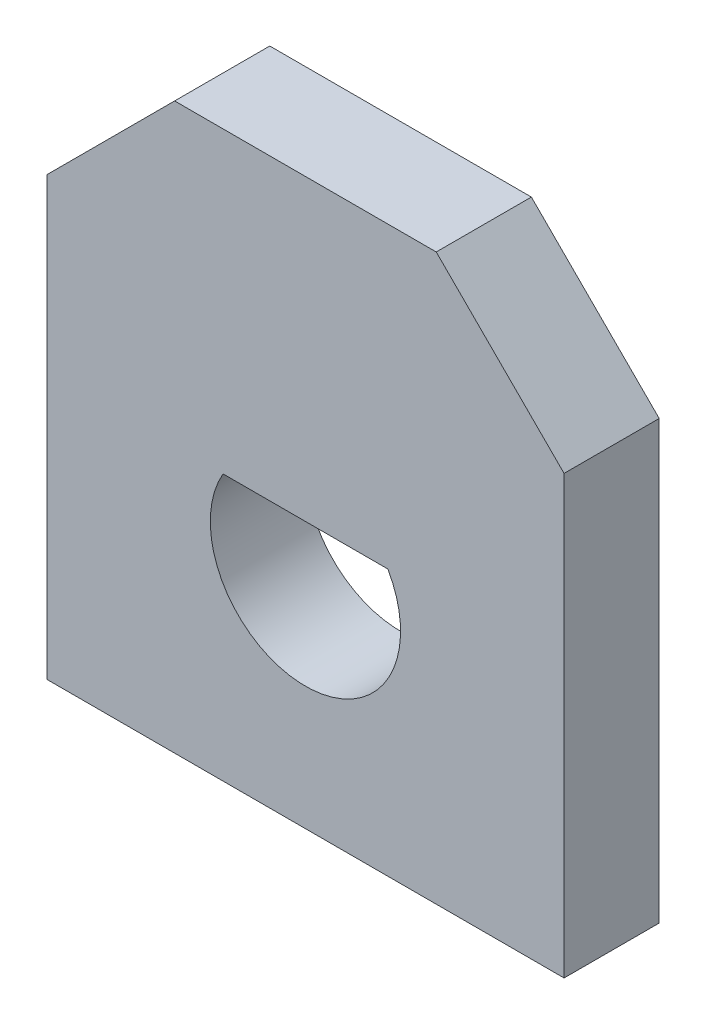
ISO-10303-21;
HEADER;
FILE_DESCRIPTION(('STEP AP214'),'2;1');
FILE_NAME('part.step','',(''),(''),'','','');
FILE_SCHEMA(('AUTOMOTIVE_DESIGN { 1 0 10303 214 1 1 1 1 }'));
ENDSEC;
DATA;
#1=APPLICATION_CONTEXT('core data for automotive mechanical design processes');
#2=APPLICATION_PROTOCOL_DEFINITION('international standard','automotive_design',2000,#1);
#3=PRODUCT_CONTEXT('',#1,'mechanical');
#4=PRODUCT('Part','Part','',(#3));
#5=PRODUCT_RELATED_PRODUCT_CATEGORY('part','',(#4));
#6=PRODUCT_DEFINITION_FORMATION('','',#4);
#7=PRODUCT_DEFINITION_CONTEXT('part definition',#1,'design');
#8=PRODUCT_DEFINITION('design','',#6,#7);
#9=PRODUCT_DEFINITION_SHAPE('','',#8);
#10=(LENGTH_UNIT() NAMED_UNIT(*) SI_UNIT(.MILLI.,.METRE.));
#11=(NAMED_UNIT(*) PLANE_ANGLE_UNIT() SI_UNIT($,.RADIAN.));
#12=(NAMED_UNIT(*) SI_UNIT($,.STERADIAN.) SOLID_ANGLE_UNIT());
#13=UNCERTAINTY_MEASURE_WITH_UNIT(LENGTH_MEASURE(1.E-05),#10,'distance_accuracy_value','');
#14=(GEOMETRIC_REPRESENTATION_CONTEXT(3) GLOBAL_UNCERTAINTY_ASSIGNED_CONTEXT((#13)) GLOBAL_UNIT_ASSIGNED_CONTEXT((#10,
#11,#12)) REPRESENTATION_CONTEXT('',''));
#15=CARTESIAN_POINT('',(0.,0.,0.));
#16=DIRECTION('',(0.,0.,1.));
#17=DIRECTION('',(1.,0.,0.));
#18=AXIS2_PLACEMENT_3D('',#15,#16,#17);
#19=CARTESIAN_POINT('',(5.5245,-11.501146748355,2.032));
#20=DIRECTION('',(1.,0.,0.));
#21=DIRECTION('',(0.,1.,0.));
#22=AXIS2_PLACEMENT_3D('',#19,#20,#21);
#23=PLANE('',#22);
#24=DIRECTION('',(0.,-1.,0.));
#25=VECTOR('',#24,1.);
#26=CARTESIAN_POINT('',(5.5245,-11.501146748355,0.));
#27=LINE('',#26,#25);
#28=CARTESIAN_POINT('',(5.5245,4.66725,0.));
#29=VERTEX_POINT('',#28);
#30=CARTESIAN_POINT('',(5.5245,-4.66724999999999,0.));
#31=VERTEX_POINT('',#30);
#32=EDGE_CURVE('E143',#29,#31,#27,.T.);
#33=ORIENTED_EDGE('',*,*,#32,.F.);
#34=DIRECTION('',(0.,0.,-1.));
#35=VECTOR('',#34,1.);
#36=CARTESIAN_POINT('',(5.5245,4.66725,2.032));
#37=LINE('',#36,#35);
#38=CARTESIAN_POINT('',(5.5245,4.66725,2.032));
#39=VERTEX_POINT('',#38);
#40=EDGE_CURVE('E11',#39,#29,#37,.T.);
#41=ORIENTED_EDGE('',*,*,#40,.F.);
#42=DIRECTION('',(0.,-1.,0.));
#43=VECTOR('',#42,1.);
#44=CARTESIAN_POINT('',(5.5245,-11.501146748355,2.032));
#45=LINE('',#44,#43);
#46=CARTESIAN_POINT('',(5.5245,-4.66724999999999,2.032));
#47=VERTEX_POINT('',#46);
#48=EDGE_CURVE('E199',#39,#47,#45,.T.);
#49=ORIENTED_EDGE('',*,*,#48,.T.);
#50=DIRECTION('',(0.,0.,-1.));
#51=VECTOR('',#50,1.);
#52=CARTESIAN_POINT('',(5.5245,-4.66724999999999,2.032));
#53=LINE('',#52,#51);
#54=EDGE_CURVE('E86',#47,#31,#53,.T.);
#55=ORIENTED_EDGE('',*,*,#54,.T.);
#56=EDGE_LOOP('',(#33,#41,#49,#55));
#57=FACE_BOUND('',#56,.T.);
#58=ADVANCED_FACE('F32',(#57),#23,.T.);
#59=CARTESIAN_POINT('',(10.8464483741775,-0.654698374177521,2.032));
#60=DIRECTION('',(0.707106781186549,0.707106781186546,0.));
#61=DIRECTION('',(-0.707106781186546,0.707106781186549,0.));
#62=AXIS2_PLACEMENT_3D('',#59,#60,#61);
#63=PLANE('',#62);
#64=DIRECTION('',(0.707106781186546,-0.707106781186549,0.));
#65=VECTOR('',#64,1.);
#66=CARTESIAN_POINT('',(10.8464483741775,-0.654698374177521,0.));
#67=LINE('',#66,#65);
#68=CARTESIAN_POINT('',(2.794,7.39775000000001,0.));
#69=VERTEX_POINT('',#68);
#70=EDGE_CURVE('E145',#69,#29,#67,.T.);
#71=ORIENTED_EDGE('',*,*,#70,.F.);
#72=DIRECTION('',(0.,0.,-1.));
#73=VECTOR('',#72,1.);
#74=CARTESIAN_POINT('',(2.794,7.39775000000001,2.032));
#75=LINE('',#74,#73);
#76=CARTESIAN_POINT('',(2.794,7.39775000000001,2.032));
#77=VERTEX_POINT('',#76);
#78=EDGE_CURVE('E42',#77,#69,#75,.T.);
#79=ORIENTED_EDGE('',*,*,#78,.F.);
#80=DIRECTION('',(0.707106781186546,-0.707106781186549,0.));
#81=VECTOR('',#80,1.);
#82=CARTESIAN_POINT('',(10.8464483741775,-0.654698374177521,2.032));
#83=LINE('',#82,#81);
#84=EDGE_CURVE('E131',#77,#39,#83,.T.);
#85=ORIENTED_EDGE('',*,*,#84,.T.);
#86=ORIENTED_EDGE('',*,*,#40,.T.);
#87=EDGE_LOOP('',(#71,#79,#85,#86));
#88=FACE_BOUND('',#87,.T.);
#89=ADVANCED_FACE('F175',(#88),#63,.T.);
#90=CARTESIAN_POINT('',(0.,7.39775000000001,2.032));
#91=DIRECTION('',(0.,1.,0.));
#92=DIRECTION('',(0.,0.,1.));
#93=AXIS2_PLACEMENT_3D('',#90,#91,#92);
#94=PLANE('',#93);
#95=DIRECTION('',(1.,0.,0.));
#96=VECTOR('',#95,1.);
#97=CARTESIAN_POINT('',(0.,7.39775000000001,0.));
#98=LINE('',#97,#96);
#99=CARTESIAN_POINT('',(-2.794,7.39775000000001,0.));
#100=VERTEX_POINT('',#99);
#101=EDGE_CURVE('E148',#100,#69,#98,.T.);
#102=ORIENTED_EDGE('',*,*,#101,.F.);
#103=DIRECTION('',(0.,0.,-1.));
#104=VECTOR('',#103,1.);
#105=CARTESIAN_POINT('',(-2.794,7.39775000000001,2.032));
#106=LINE('',#105,#104);
#107=CARTESIAN_POINT('',(-2.794,7.39775000000001,2.032));
#108=VERTEX_POINT('',#107);
#109=EDGE_CURVE('E118',#108,#100,#106,.T.);
#110=ORIENTED_EDGE('',*,*,#109,.F.);
#111=DIRECTION('',(1.,0.,0.));
#112=VECTOR('',#111,1.);
#113=CARTESIAN_POINT('',(0.,7.39775000000001,2.032));
#114=LINE('',#113,#112);
#115=EDGE_CURVE('E129',#108,#77,#114,.T.);
#116=ORIENTED_EDGE('',*,*,#115,.T.);
#117=ORIENTED_EDGE('',*,*,#78,.T.);
#118=EDGE_LOOP('',(#102,#110,#116,#117));
#119=FACE_BOUND('',#118,.T.);
#120=ADVANCED_FACE('F180',(#119),#94,.T.);
#121=CARTESIAN_POINT('',(-10.8464483741775,-0.654698374177511,2.032));
#122=DIRECTION('',(-0.707106781186549,0.707106781186546,0.));
#123=DIRECTION('',(-0.707106781186546,-0.707106781186549,0.));
#124=AXIS2_PLACEMENT_3D('',#121,#122,#123);
#125=PLANE('',#124);
#126=DIRECTION('',(0.707106781186546,0.707106781186549,0.));
#127=VECTOR('',#126,1.);
#128=CARTESIAN_POINT('',(-10.8464483741775,-0.654698374177511,0.));
#129=LINE('',#128,#127);
#130=CARTESIAN_POINT('',(-5.5245,4.66725,0.));
#131=VERTEX_POINT('',#130);
#132=EDGE_CURVE('E115',#131,#100,#129,.T.);
#133=ORIENTED_EDGE('',*,*,#132,.F.);
#134=DIRECTION('',(0.,0.,-1.));
#135=VECTOR('',#134,1.);
#136=CARTESIAN_POINT('',(-5.5245,4.66725,2.032));
#137=LINE('',#136,#135);
#138=CARTESIAN_POINT('',(-5.5245,4.66725,2.032));
#139=VERTEX_POINT('',#138);
#140=EDGE_CURVE('E109',#139,#131,#137,.T.);
#141=ORIENTED_EDGE('',*,*,#140,.F.);
#142=DIRECTION('',(0.707106781186546,0.707106781186549,0.));
#143=VECTOR('',#142,1.);
#144=CARTESIAN_POINT('',(-10.8464483741775,-0.654698374177511,2.032));
#145=LINE('',#144,#143);
#146=EDGE_CURVE('E113',#139,#108,#145,.T.);
#147=ORIENTED_EDGE('',*,*,#146,.T.);
#148=ORIENTED_EDGE('',*,*,#109,.T.);
#149=EDGE_LOOP('',(#133,#141,#147,#148));
#150=FACE_BOUND('',#149,.T.);
#151=ADVANCED_FACE('F111',(#150),#125,.T.);
#152=CARTESIAN_POINT('',(-5.5245,-11.501146748355,2.032));
#153=DIRECTION('',(1.,0.,0.));
#154=DIRECTION('',(0.,0.,-1.));
#155=AXIS2_PLACEMENT_3D('',#152,#153,#154);
#156=PLANE('',#155);
#157=DIRECTION('',(0.,-1.,0.));
#158=VECTOR('',#157,1.);
#159=CARTESIAN_POINT('',(-5.5245,-11.501146748355,0.));
#160=LINE('',#159,#158);
#161=CARTESIAN_POINT('',(-5.5245,-4.66724999999999,0.));
#162=VERTEX_POINT('',#161);
#163=EDGE_CURVE('E152',#131,#162,#160,.T.);
#164=ORIENTED_EDGE('',*,*,#163,.T.);
#165=DIRECTION('',(0.,0.,-1.));
#166=VECTOR('',#165,1.);
#167=CARTESIAN_POINT('',(-5.5245,-4.66724999999999,2.032));
#168=LINE('',#167,#166);
#169=CARTESIAN_POINT('',(-5.5245,-4.66724999999999,2.032));
#170=VERTEX_POINT('',#169);
#171=EDGE_CURVE('E119',#170,#162,#168,.T.);
#172=ORIENTED_EDGE('',*,*,#171,.F.);
#173=DIRECTION('',(0.,-1.,0.));
#174=VECTOR('',#173,1.);
#175=CARTESIAN_POINT('',(-5.5245,-11.501146748355,2.032));
#176=LINE('',#175,#174);
#177=EDGE_CURVE('E122',#139,#170,#176,.T.);
#178=ORIENTED_EDGE('',*,*,#177,.F.);
#179=ORIENTED_EDGE('',*,*,#140,.T.);
#180=EDGE_LOOP('',(#164,#172,#178,#179));
#181=FACE_BOUND('',#180,.T.);
#182=ADVANCED_FACE('F123',(#181),#156,.F.);
#183=CARTESIAN_POINT('',(0.,0.,2.032));
#184=DIRECTION('',(0.,0.,-1.));
#185=DIRECTION('',(-1.,0.,0.));
#186=AXIS2_PLACEMENT_3D('',#183,#184,#185);
#187=CYLINDRICAL_SURFACE('',#186,2.032);
#188=CARTESIAN_POINT('',(0.,0.,0.));
#189=DIRECTION('',(0.,0.,1.));
#190=DIRECTION('',(1.,0.,0.));
#191=AXIS2_PLACEMENT_3D('',#188,#189,#190);
#192=CIRCLE('',#191,2.032);
#193=CARTESIAN_POINT('',(-1.75976362048998,1.016,0.));
#194=VERTEX_POINT('',#193);
#195=CARTESIAN_POINT('',(1.75976362048998,1.016,0.));
#196=VERTEX_POINT('',#195);
#197=EDGE_CURVE('E137',#194,#196,#192,.T.);
#198=ORIENTED_EDGE('',*,*,#197,.F.);
#199=DIRECTION('',(0.,0.,-1.));
#200=VECTOR('',#199,1.);
#201=CARTESIAN_POINT('',(-1.75976362048998,1.016,2.032));
#202=LINE('',#201,#200);
#203=CARTESIAN_POINT('',(-1.75976362048998,1.016,2.032));
#204=VERTEX_POINT('',#203);
#205=EDGE_CURVE('E36',#204,#194,#202,.T.);
#206=ORIENTED_EDGE('',*,*,#205,.F.);
#207=CARTESIAN_POINT('',(0.,0.,2.032));
#208=DIRECTION('',(0.,0.,1.));
#209=DIRECTION('',(1.,0.,0.));
#210=AXIS2_PLACEMENT_3D('',#207,#208,#209);
#211=CIRCLE('',#210,2.032);
#212=CARTESIAN_POINT('',(1.75976362048998,1.016,2.032));
#213=VERTEX_POINT('',#212);
#214=EDGE_CURVE('E155',#204,#213,#211,.T.);
#215=ORIENTED_EDGE('',*,*,#214,.T.);
#216=DIRECTION('',(0.,0.,-1.));
#217=VECTOR('',#216,1.);
#218=CARTESIAN_POINT('',(1.75976362048998,1.016,2.032));
#219=LINE('',#218,#217);
#220=EDGE_CURVE('E136',#213,#196,#219,.T.);
#221=ORIENTED_EDGE('',*,*,#220,.T.);
#222=EDGE_LOOP('',(#198,#206,#215,#221));
#223=FACE_BOUND('',#222,.T.);
#224=ADVANCED_FACE('F34',(#223),#187,.F.);
#225=CARTESIAN_POINT('',(0.,1.016,2.032));
#226=DIRECTION('',(0.,1.,0.));
#227=DIRECTION('',(0.,0.,1.));
#228=AXIS2_PLACEMENT_3D('',#225,#226,#227);
#229=PLANE('',#228);
#230=DIRECTION('',(1.,0.,0.));
#231=VECTOR('',#230,1.);
#232=CARTESIAN_POINT('',(0.,1.016,0.));
#233=LINE('',#232,#231);
#234=EDGE_CURVE('E140',#194,#196,#233,.T.);
#235=ORIENTED_EDGE('',*,*,#234,.T.);
#236=ORIENTED_EDGE('',*,*,#220,.F.);
#237=DIRECTION('',(1.,0.,0.));
#238=VECTOR('',#237,1.);
#239=CARTESIAN_POINT('',(0.,1.016,2.032));
#240=LINE('',#239,#238);
#241=EDGE_CURVE('E163',#204,#213,#240,.T.);
#242=ORIENTED_EDGE('',*,*,#241,.F.);
#243=ORIENTED_EDGE('',*,*,#205,.T.);
#244=EDGE_LOOP('',(#235,#236,#242,#243));
#245=FACE_BOUND('',#244,.T.);
#246=ADVANCED_FACE('F162',(#245),#229,.F.);
#247=CARTESIAN_POINT('',(0.,-4.66724999999999,2.032));
#248=DIRECTION('',(0.,1.,0.));
#249=DIRECTION('',(0.,0.,1.));
#250=AXIS2_PLACEMENT_3D('',#247,#248,#249);
#251=PLANE('',#250);
#252=DIRECTION('',(1.,0.,0.));
#253=VECTOR('',#252,1.);
#254=CARTESIAN_POINT('',(0.,-4.66724999999999,0.));
#255=LINE('',#254,#253);
#256=EDGE_CURVE('E79',#162,#31,#255,.T.);
#257=ORIENTED_EDGE('',*,*,#256,.T.);
#258=ORIENTED_EDGE('',*,*,#54,.F.);
#259=DIRECTION('',(1.,0.,0.));
#260=VECTOR('',#259,1.);
#261=CARTESIAN_POINT('',(0.,-4.66724999999999,2.032));
#262=LINE('',#261,#260);
#263=EDGE_CURVE('E51',#170,#47,#262,.T.);
#264=ORIENTED_EDGE('',*,*,#263,.F.);
#265=ORIENTED_EDGE('',*,*,#171,.T.);
#266=EDGE_LOOP('',(#257,#258,#264,#265));
#267=FACE_BOUND('',#266,.T.);
#268=ADVANCED_FACE('F172',(#267),#251,.F.);
#269=CARTESIAN_POINT('',(0.,-11.501146748355,2.032));
#270=DIRECTION('',(0.,0.,1.));
#271=DIRECTION('',(1.,0.,0.));
#272=AXIS2_PLACEMENT_3D('',#269,#270,#271);
#273=PLANE('',#272);
#274=ORIENTED_EDGE('',*,*,#214,.F.);
#275=ORIENTED_EDGE('',*,*,#241,.T.);
#276=EDGE_LOOP('',(#274,#275));
#277=FACE_BOUND('',#276,.T.);
#278=ORIENTED_EDGE('',*,*,#48,.F.);
#279=ORIENTED_EDGE('',*,*,#84,.F.);
#280=ORIENTED_EDGE('',*,*,#115,.F.);
#281=ORIENTED_EDGE('',*,*,#146,.F.);
#282=ORIENTED_EDGE('',*,*,#177,.T.);
#283=ORIENTED_EDGE('',*,*,#263,.T.);
#284=EDGE_LOOP('',(#278,#279,#280,#281,#282,#283));
#285=FACE_BOUND('',#284,.T.);
#286=ADVANCED_FACE('F126',(#277,#285),#273,.T.);
#287=CARTESIAN_POINT('',(0.,-11.501146748355,0.));
#288=DIRECTION('',(0.,0.,1.));
#289=DIRECTION('',(1.,0.,0.));
#290=AXIS2_PLACEMENT_3D('',#287,#288,#289);
#291=PLANE('',#290);
#292=ORIENTED_EDGE('',*,*,#197,.T.);
#293=ORIENTED_EDGE('',*,*,#234,.F.);
#294=EDGE_LOOP('',(#292,#293));
#295=FACE_BOUND('',#294,.T.);
#296=ORIENTED_EDGE('',*,*,#32,.T.);
#297=ORIENTED_EDGE('',*,*,#256,.F.);
#298=ORIENTED_EDGE('',*,*,#163,.F.);
#299=ORIENTED_EDGE('',*,*,#132,.T.);
#300=ORIENTED_EDGE('',*,*,#101,.T.);
#301=ORIENTED_EDGE('',*,*,#70,.T.);
#302=EDGE_LOOP('',(#296,#297,#298,#299,#300,#301));
#303=FACE_BOUND('',#302,.T.);
#304=ADVANCED_FACE('F166',(#295,#303),#291,.F.);
#305=CLOSED_SHELL('',(#58,#89,#120,#151,#182,#224,#246,#268,#286,#304));
#306=MANIFOLD_SOLID_BREP('B2',#305);
#307=ADVANCED_BREP_SHAPE_REPRESENTATION('',(#18,#306),#14);
#308=SHAPE_DEFINITION_REPRESENTATION(#9,#307);
ENDSEC;
END-ISO-10303-21;
